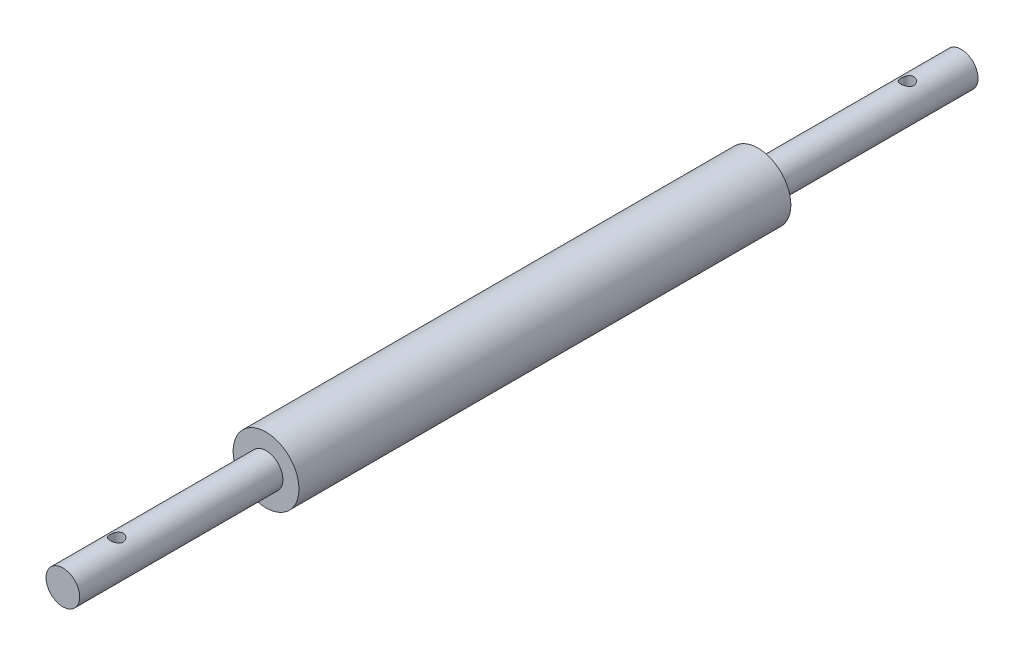
ISO-10303-21;
HEADER;
FILE_DESCRIPTION(('STEP AP214'),'2;1');
FILE_NAME('part.step','',(''),(''),'','','');
FILE_SCHEMA(('AUTOMOTIVE_DESIGN { 1 0 10303 214 1 1 1 1 }'));
ENDSEC;
DATA;
#1=APPLICATION_CONTEXT('core data for automotive mechanical design processes');
#2=APPLICATION_PROTOCOL_DEFINITION('international standard','automotive_design',2000,#1);
#3=PRODUCT_CONTEXT('',#1,'mechanical');
#4=PRODUCT('Part','Part','',(#3));
#5=PRODUCT_RELATED_PRODUCT_CATEGORY('part','',(#4));
#6=PRODUCT_DEFINITION_FORMATION('','',#4);
#7=PRODUCT_DEFINITION_CONTEXT('part definition',#1,'design');
#8=PRODUCT_DEFINITION('design','',#6,#7);
#9=PRODUCT_DEFINITION_SHAPE('','',#8);
#10=(LENGTH_UNIT() NAMED_UNIT(*) SI_UNIT(.MILLI.,.METRE.));
#11=(NAMED_UNIT(*) PLANE_ANGLE_UNIT() SI_UNIT($,.RADIAN.));
#12=(NAMED_UNIT(*) SI_UNIT($,.STERADIAN.) SOLID_ANGLE_UNIT());
#13=UNCERTAINTY_MEASURE_WITH_UNIT(LENGTH_MEASURE(1.E-05),#10,'distance_accuracy_value','');
#14=(GEOMETRIC_REPRESENTATION_CONTEXT(3) GLOBAL_UNCERTAINTY_ASSIGNED_CONTEXT((#13)) GLOBAL_UNIT_ASSIGNED_CONTEXT((#10,
#11,#12)) REPRESENTATION_CONTEXT('',''));
#15=CARTESIAN_POINT('',(0.,0.,0.));
#16=DIRECTION('',(0.,0.,1.));
#17=DIRECTION('',(1.,0.,0.));
#18=AXIS2_PLACEMENT_3D('',#15,#16,#17);
#19=CARTESIAN_POINT('',(49.9999999999997,120.4,173.5));
#20=DIRECTION('',(0.,0.,-1.));
#21=DIRECTION('',(-1.,0.,0.));
#22=AXIS2_PLACEMENT_3D('',#19,#20,#21);
#23=CYLINDRICAL_SURFACE('',#22,6.5);
#24=CARTESIAN_POINT('',(50.,113.9,-150.2));
#25=CARTESIAN_POINT('',(49.8648569360255,113.899995370137,-150.199993927366));
#26=CARTESIAN_POINT('',(49.7297543163098,113.904250781703,-150.210992010332));
#27=CARTESIAN_POINT('',(49.4636001063237,113.920799394986,-150.254504679692));
#28=CARTESIAN_POINT('',(49.3325477106707,113.933090987807,-150.287014959218));
#29=CARTESIAN_POINT('',(49.0783719967748,113.964396706734,-150.372223093158));
#30=CARTESIAN_POINT('',(48.9552334653472,113.983397449006,-150.424880773621));
#31=CARTESIAN_POINT('',(48.7195509109868,114.026240073069,-150.548679086722));
#32=CARTESIAN_POINT('',(48.6070098904103,114.050083320774,-150.619824935867));
#33=CARTESIAN_POINT('',(48.3907274132546,114.101342120172,-150.781869571504));
#34=CARTESIAN_POINT('',(48.287517270289,114.128862346074,-150.873444061664));
#35=CARTESIAN_POINT('',(48.0974862658747,114.183872117362,-151.072312088808));
#36=CARTESIAN_POINT('',(48.0106708066665,114.211361649679,-151.17961078649));
#37=CARTESIAN_POINT('',(47.8524265832136,114.264432533301,-151.412174979189));
#38=CARTESIAN_POINT('',(47.7817633689856,114.289891515449,-151.537992128593));
#39=CARTESIAN_POINT('',(47.6628381082266,114.334380814589,-151.800856659822));
#40=CARTESIAN_POINT('',(47.6145665843167,114.353413850462,-151.937899261474));
#41=CARTESIAN_POINT('',(47.5439173709796,114.381772691875,-152.213196736226));
#42=CARTESIAN_POINT('',(47.5205219879901,114.391478308187,-152.351149953308));
#43=CARTESIAN_POINT('',(47.4971080052481,114.401191051695,-152.629339459977));
#44=CARTESIAN_POINT('',(47.4970790955748,114.401202456239,-152.769574715353));
#45=CARTESIAN_POINT('',(47.5196234368706,114.391851624264,-153.038864258152));
#46=CARTESIAN_POINT('',(47.5407620429355,114.383084370669,-153.168063212915));
#47=CARTESIAN_POINT('',(47.6026619386656,114.358156596172,-153.420915079407));
#48=CARTESIAN_POINT('',(47.6434263425707,114.341994901932,-153.544567107539));
#49=CARTESIAN_POINT('',(47.744173360771,114.303756298309,-153.785658311782));
#50=CARTESIAN_POINT('',(47.8045154952335,114.28157010805,-153.902929152217));
#51=CARTESIAN_POINT('',(47.9424538839718,114.233816323288,-154.126087878502));
#52=CARTESIAN_POINT('',(48.0200563076405,114.208247521055,-154.231971674123));
#53=CARTESIAN_POINT('',(48.1967948466707,114.154396548195,-154.437259161246));
#54=CARTESIAN_POINT('',(48.297068555506,114.126050611602,-154.53566921961));
#55=CARTESIAN_POINT('',(48.5130136095442,114.071393131742,-154.714580669283));
#56=CARTESIAN_POINT('',(48.62868756797,114.045081934944,-154.795079015001));
#57=CARTESIAN_POINT('',(48.8747908924492,113.996885932677,-154.937055048215));
#58=CARTESIAN_POINT('',(49.0054379008434,113.975084093005,-154.998185657593));
#59=CARTESIAN_POINT('',(49.2762103335865,113.93898298564,-155.097266102549));
#60=CARTESIAN_POINT('',(49.4163312860351,113.92468020576,-155.135226791131));
#61=CARTESIAN_POINT('',(49.6937241259577,113.90581476875,-155.184942181762));
#62=CARTESIAN_POINT('',(49.8307228227463,113.900755779516,-155.198033878958));
#63=CARTESIAN_POINT('',(50.1050380560697,113.899402939048,-155.201553438037));
#64=CARTESIAN_POINT('',(50.2423545101173,113.903107023036,-155.191986638772));
#65=CARTESIAN_POINT('',(50.5075233914846,113.91853747347,-155.15146491566));
#66=CARTESIAN_POINT('',(50.6355332786326,113.929929936224,-155.121399693969));
#67=CARTESIAN_POINT('',(50.8845911124195,113.959252047836,-155.041920769499));
#68=CARTESIAN_POINT('',(51.0056381538334,113.977182544477,-154.992504557429));
#69=CARTESIAN_POINT('',(51.2413976272735,114.018488371272,-154.874132384767));
#70=CARTESIAN_POINT('',(51.3558122909773,114.042010519008,-154.804636185622));
#71=CARTESIAN_POINT('',(51.5717472094606,114.091916869993,-154.648682871873));
#72=CARTESIAN_POINT('',(51.6732625124397,114.118302165183,-154.562219276043));
#73=CARTESIAN_POINT('',(51.867008663459,114.173040176701,-154.368580249317));
#74=CARTESIAN_POINT('',(51.9582939990394,114.201414643799,-154.260462461031));
#75=CARTESIAN_POINT('',(52.1216298075656,114.255400121447,-154.029904597358));
#76=CARTESIAN_POINT('',(52.1936780477103,114.281010811008,-153.907462861796));
#77=CARTESIAN_POINT('',(52.3167016588595,114.326513011289,-153.650423952603));
#78=CARTESIAN_POINT('',(52.3675457507259,114.346368667284,-153.515757160765));
#79=CARTESIAN_POINT('',(52.4454786278655,114.377423472433,-153.238789394497));
#80=CARTESIAN_POINT('',(52.4725831636482,114.388628360536,-153.09649354834));
#81=CARTESIAN_POINT('',(52.5008221053295,114.400324973139,-152.818611399132));
#82=CARTESIAN_POINT('',(52.5035796294326,114.401486156865,-152.68321698093));
#83=CARTESIAN_POINT('',(52.4872441285209,114.394694525215,-152.413998907565));
#84=CARTESIAN_POINT('',(52.4681534084365,114.386742671239,-152.280175088212));
#85=CARTESIAN_POINT('',(52.4099513674169,114.36319107724,-152.022503937197));
#86=CARTESIAN_POINT('',(52.3715382839678,114.347858817028,-151.898472297688));
#87=CARTESIAN_POINT('',(52.276411151596,114.311442436843,-151.658550206541));
#88=CARTESIAN_POINT('',(52.2196923673986,114.290356828826,-151.542661870848));
#89=CARTESIAN_POINT('',(52.085993195051,114.243385216856,-151.315464696426));
#90=CARTESIAN_POINT('',(52.0080793942802,114.21730064338,-151.204746758524));
#91=CARTESIAN_POINT('',(51.8356157399033,114.163922938996,-150.997440282091));
#92=CARTESIAN_POINT('',(51.7410604619884,114.136629416208,-150.900856369419));
#93=CARTESIAN_POINT('',(51.5314383021902,114.08200394833,-150.718824624031));
#94=CARTESIAN_POINT('',(51.4154988293532,114.054761919151,-150.63434994106));
#95=CARTESIAN_POINT('',(51.1701071623707,114.004961723837,-150.486089140357));
#96=CARTESIAN_POINT('',(51.0406527047282,113.982404344186,-150.422306495509));
#97=CARTESIAN_POINT('',(50.7629008422325,113.943308605623,-150.314295580981));
#98=CARTESIAN_POINT('',(50.6139250375314,113.927259294457,-150.271615623945));
#99=CARTESIAN_POINT('',(50.3099460978443,113.905610637558,-150.214479395075));
#100=CARTESIAN_POINT('',(50.1549464660004,113.900005308307,-150.200006962497));
#101=CARTESIAN_POINT('',(50.,113.9,-150.2));
#102=B_SPLINE_CURVE_WITH_KNOTS('',3,(#24,#25,#26,#27,#28,#29,#30,#31,#32,#33,#34,#35,#36,#37,
#38,#39,#40,#41,#42,#43,#44,#45,#46,#47,#48,#49,#50,#51,#52,#53,#54,#55,#56,#57,#58,#59,#60,#61,
#62,#63,#64,#65,#66,#67,#68,#69,#70,#71,#72,#73,#74,#75,#76,#77,#78,#79,#80,#81,#82,#83,#84,#85,
#86,#87,#88,#89,#90,#91,#92,#93,#94,#95,#96,#97,#98,#99,#100,#101),.UNSPECIFIED.,.T.,.F.,(4,2,2,
2,2,2,2,2,2,2,2,2,2,2,2,2,2,2,2,2,2,2,2,2,2,2,2,2,2,2,2,2,2,2,2,2,2,2,4),(0.,0.404857395673165,
0.809633761045258,1.21360717298343,1.61769469151933,2.03792903302861,2.45830160597863,
2.8956990771273,3.33291124861785,3.75145366078395,4.1698114006033,4.56161223088487,
4.95347525299,5.35298551114873,5.75263879750163,6.18066348321893,6.60876089197116,
7.04414506400745,7.47932514126758,7.89036278979613,8.30130359821625,8.69545686414669,
9.08966125783838,9.4956566096056,9.90180734683235,10.3327599285419,10.7637625081092,
11.1973952581665,11.6307400870075,12.0349578310579,12.4391329351611,12.8296520191847,
13.2202722028207,13.6321153154032,14.0440929181879,14.4800085178991,14.9159972424678,
15.3804472276237,15.8446310403092),.UNSPECIFIED.);
#103=CARTESIAN_POINT('',(50.,113.9,-150.2));
#104=VERTEX_POINT('',#103);
#105=EDGE_CURVE('E38',#104,#104,#102,.T.);
#106=ORIENTED_EDGE('',*,*,#105,.F.);
#107=EDGE_LOOP('',(#106));
#108=FACE_BOUND('',#107,.T.);
#109=CARTESIAN_POINT('',(50.,126.9,-150.2));
#110=CARTESIAN_POINT('',(50.1351430639745,126.900004629863,-150.199993927366));
#111=CARTESIAN_POINT('',(50.2702456836902,126.895749218297,-150.210992010332));
#112=CARTESIAN_POINT('',(50.5363998936764,126.879200605014,-150.254504679692));
#113=CARTESIAN_POINT('',(50.6674522893293,126.866909012193,-150.287014959218));
#114=CARTESIAN_POINT('',(50.9216280032252,126.835603293266,-150.372223093158));
#115=CARTESIAN_POINT('',(51.0447665346528,126.816602550994,-150.424880773621));
#116=CARTESIAN_POINT('',(51.2804490890132,126.773759926931,-150.548679086722));
#117=CARTESIAN_POINT('',(51.3929901095897,126.749916679226,-150.619824935867));
#118=CARTESIAN_POINT('',(51.6092725867455,126.698657879828,-150.781869571504));
#119=CARTESIAN_POINT('',(51.7124827297111,126.671137653926,-150.873444061664));
#120=CARTESIAN_POINT('',(51.9025137341253,126.616127882637,-151.072312088808));
#121=CARTESIAN_POINT('',(51.9893291933336,126.588638350321,-151.17961078649));
#122=CARTESIAN_POINT('',(52.1475734167864,126.535567466699,-151.412174979189));
#123=CARTESIAN_POINT('',(52.2182366310144,126.510108484551,-151.537992128593));
#124=CARTESIAN_POINT('',(52.3371618917734,126.46561918541,-151.800856659822));
#125=CARTESIAN_POINT('',(52.3854334156833,126.446586149538,-151.937899261474));
#126=CARTESIAN_POINT('',(52.4560826290204,126.418227308125,-152.213196736226));
#127=CARTESIAN_POINT('',(52.4794780120099,126.408521691813,-152.351149953308));
#128=CARTESIAN_POINT('',(52.5028919947519,126.398808948305,-152.629339459977));
#129=CARTESIAN_POINT('',(52.5029209044252,126.398797543761,-152.769574715353));
#130=CARTESIAN_POINT('',(52.4803765631294,126.408148375736,-153.038864258152));
#131=CARTESIAN_POINT('',(52.4592379570645,126.416915629331,-153.168063212915));
#132=CARTESIAN_POINT('',(52.3973380613344,126.441843403828,-153.420915079407));
#133=CARTESIAN_POINT('',(52.3565736574293,126.458005098068,-153.544567107539));
#134=CARTESIAN_POINT('',(52.255826639229,126.496243701691,-153.785658311782));
#135=CARTESIAN_POINT('',(52.1954845047665,126.518429891949,-153.902929152217));
#136=CARTESIAN_POINT('',(52.0575461160282,126.566183676712,-154.126087878502));
#137=CARTESIAN_POINT('',(51.9799436923595,126.591752478945,-154.231971674123));
#138=CARTESIAN_POINT('',(51.8032051533293,126.645603451805,-154.437259161246));
#139=CARTESIAN_POINT('',(51.702931444494,126.673949388398,-154.53566921961));
#140=CARTESIAN_POINT('',(51.4869863904558,126.728606868258,-154.714580669283));
#141=CARTESIAN_POINT('',(51.37131243203,126.754918065056,-154.795079015001));
#142=CARTESIAN_POINT('',(51.1252091075508,126.803114067323,-154.937055048215));
#143=CARTESIAN_POINT('',(50.9945620991566,126.824915906994,-154.998185657593));
#144=CARTESIAN_POINT('',(50.7237896664135,126.86101701436,-155.097266102549));
#145=CARTESIAN_POINT('',(50.583668713965,126.875319794239,-155.135226791131));
#146=CARTESIAN_POINT('',(50.3062758740423,126.89418523125,-155.184942181762));
#147=CARTESIAN_POINT('',(50.1692771772537,126.899244220484,-155.198033878958));
#148=CARTESIAN_POINT('',(49.8949619439303,126.900597060952,-155.201553438037));
#149=CARTESIAN_POINT('',(49.7576454898827,126.896892976964,-155.191986638772));
#150=CARTESIAN_POINT('',(49.4924766085154,126.88146252653,-155.15146491566));
#151=CARTESIAN_POINT('',(49.3644667213674,126.870070063776,-155.121399693969));
#152=CARTESIAN_POINT('',(49.1154088875804,126.840747952164,-155.041920769499));
#153=CARTESIAN_POINT('',(48.9943618461666,126.822817455523,-154.992504557429));
#154=CARTESIAN_POINT('',(48.7586023727265,126.781511628728,-154.874132384767));
#155=CARTESIAN_POINT('',(48.6441877090227,126.757989480992,-154.804636185622));
#156=CARTESIAN_POINT('',(48.4282527905394,126.708083130007,-154.648682871873));
#157=CARTESIAN_POINT('',(48.3267374875602,126.681697834817,-154.562219276043));
#158=CARTESIAN_POINT('',(48.132991336541,126.626959823299,-154.368580249317));
#159=CARTESIAN_POINT('',(48.0417060009606,126.598585356201,-154.260462461031));
#160=CARTESIAN_POINT('',(47.8783701924343,126.544599878553,-154.029904597358));
#161=CARTESIAN_POINT('',(47.8063219522897,126.518989188993,-153.907462861796));
#162=CARTESIAN_POINT('',(47.6832983411405,126.473486988711,-153.650423952603));
#163=CARTESIAN_POINT('',(47.6324542492741,126.453631332716,-153.515757160765));
#164=CARTESIAN_POINT('',(47.5545213721345,126.422576527567,-153.238789394497));
#165=CARTESIAN_POINT('',(47.5274168363518,126.411371639464,-153.09649354834));
#166=CARTESIAN_POINT('',(47.4991778946705,126.399675026861,-152.818611399132));
#167=CARTESIAN_POINT('',(47.4964203705674,126.398513843135,-152.68321698093));
#168=CARTESIAN_POINT('',(47.5127558714792,126.405305474785,-152.413998907565));
#169=CARTESIAN_POINT('',(47.5318465915635,126.413257328761,-152.280175088212));
#170=CARTESIAN_POINT('',(47.5900486325831,126.43680892276,-152.022503937197));
#171=CARTESIAN_POINT('',(47.6284617160322,126.452141182972,-151.898472297688));
#172=CARTESIAN_POINT('',(47.723588848404,126.488557563157,-151.658550206541));
#173=CARTESIAN_POINT('',(47.7803076326014,126.509643171174,-151.542661870848));
#174=CARTESIAN_POINT('',(47.914006804949,126.556614783144,-151.315464696426));
#175=CARTESIAN_POINT('',(47.9919206057199,126.582699356621,-151.204746758524));
#176=CARTESIAN_POINT('',(48.1643842600968,126.636077061004,-150.997440282091));
#177=CARTESIAN_POINT('',(48.2589395380117,126.663370583792,-150.900856369419));
#178=CARTESIAN_POINT('',(48.4685616978099,126.71799605167,-150.718824624031));
#179=CARTESIAN_POINT('',(48.5845011706469,126.745238080849,-150.63434994106));
#180=CARTESIAN_POINT('',(48.8298928376294,126.795038276163,-150.486089140357));
#181=CARTESIAN_POINT('',(48.9593472952718,126.817595655814,-150.422306495509));
#182=CARTESIAN_POINT('',(49.2370991577676,126.856691394377,-150.314295580981));
#183=CARTESIAN_POINT('',(49.3860749624686,126.872740705543,-150.271615623945));
#184=CARTESIAN_POINT('',(49.6900539021558,126.894389362442,-150.214479395075));
#185=CARTESIAN_POINT('',(49.8450535339997,126.899994691693,-150.200006962497));
#186=CARTESIAN_POINT('',(50.,126.9,-150.2));
#187=B_SPLINE_CURVE_WITH_KNOTS('',3,(#109,#110,#111,#112,#113,#114,#115,#116,#117,#118,#119,
#120,#121,#122,#123,#124,#125,#126,#127,#128,#129,#130,#131,#132,#133,#134,#135,#136,#137,#138,
#139,#140,#141,#142,#143,#144,#145,#146,#147,#148,#149,#150,#151,#152,#153,#154,#155,#156,#157,
#158,#159,#160,#161,#162,#163,#164,#165,#166,#167,#168,#169,#170,#171,#172,#173,#174,#175,#176,
#177,#178,#179,#180,#181,#182,#183,#184,#185,#186),.UNSPECIFIED.,.T.,.F.,(4,2,2,2,2,2,2,2,2,2,2,
2,2,2,2,2,2,2,2,2,2,2,2,2,2,2,2,2,2,2,2,2,2,2,2,2,2,2,4),(0.,0.404857395673187,
0.809633761045283,1.21360717298345,1.61769469151939,2.03792903302869,2.45830160597873,
2.89569907712739,3.33291124861794,3.75145366078399,4.16981140060339,4.56161223088494,
4.95347525299004,5.3529855111488,5.75263879750169,6.18066348321899,6.60876089197121,
7.04414506400752,7.47932514126764,7.89036278979621,8.30130359821635,8.69545686414679,
9.08966125783846,9.4956566096057,9.90180734683243,10.332759928542,10.7637625081093,
11.1973952581666,11.6307400870075,12.034957831058,12.4391329351612,12.8296520191848,
13.2202722028208,13.6321153154033,14.044092918188,14.4800085178992,14.9159972424679,
15.3804472276238,15.8446310403092),.UNSPECIFIED.);
#188=CARTESIAN_POINT('',(50.,126.9,-150.2));
#189=VERTEX_POINT('',#188);
#190=EDGE_CURVE('E110',#189,#189,#187,.T.);
#191=ORIENTED_EDGE('',*,*,#190,.F.);
#192=EDGE_LOOP('',(#191));
#193=FACE_BOUND('',#192,.T.);
#194=CARTESIAN_POINT('',(49.9999999999997,120.4,-173.5));
#195=DIRECTION('',(0.,0.,-1.));
#196=DIRECTION('',(-1.,0.,0.));
#197=AXIS2_PLACEMENT_3D('',#194,#195,#196);
#198=CIRCLE('',#197,6.5);
#199=CARTESIAN_POINT('',(43.4999999999997,120.4,-173.5));
#200=VERTEX_POINT('',#199);
#201=EDGE_CURVE('E51',#200,#200,#198,.T.);
#202=ORIENTED_EDGE('',*,*,#201,.F.);
#203=EDGE_LOOP('',(#202));
#204=FACE_BOUND('',#203,.T.);
#205=CARTESIAN_POINT('',(49.9999999999997,120.4,-95.));
#206=DIRECTION('',(0.,0.,1.));
#207=DIRECTION('',(1.,0.,0.));
#208=AXIS2_PLACEMENT_3D('',#205,#206,#207);
#209=CIRCLE('',#208,6.5);
#210=CARTESIAN_POINT('',(56.4999999999997,120.4,-95.));
#211=VERTEX_POINT('',#210);
#212=EDGE_CURVE('E55',#211,#211,#209,.F.);
#213=ORIENTED_EDGE('',*,*,#212,.T.);
#214=EDGE_LOOP('',(#213));
#215=FACE_BOUND('',#214,.T.);
#216=ADVANCED_FACE('F33',(#108,#193,#204,#215),#23,.T.);
#217=CARTESIAN_POINT('',(49.9999999999997,120.4,-173.5));
#218=DIRECTION('',(0.,0.,-1.));
#219=DIRECTION('',(-1.,0.,0.));
#220=AXIS2_PLACEMENT_3D('',#217,#218,#219);
#221=PLANE('',#220);
#222=ORIENTED_EDGE('',*,*,#201,.T.);
#223=EDGE_LOOP('',(#222));
#224=FACE_BOUND('',#223,.T.);
#225=ADVANCED_FACE('F89',(#224),#221,.T.);
#226=CARTESIAN_POINT('',(49.9999999999997,120.4,-95.));
#227=DIRECTION('',(0.,0.,1.));
#228=DIRECTION('',(1.,0.,0.));
#229=AXIS2_PLACEMENT_3D('',#226,#227,#228);
#230=CYLINDRICAL_SURFACE('',#229,12.7);
#231=CARTESIAN_POINT('',(49.9999999999997,120.4,-95.));
#232=DIRECTION('',(0.,0.,1.));
#233=DIRECTION('',(1.,0.,0.));
#234=AXIS2_PLACEMENT_3D('',#231,#232,#233);
#235=CIRCLE('',#234,12.7);
#236=CARTESIAN_POINT('',(62.6999999999997,120.4,-95.));
#237=VERTEX_POINT('',#236);
#238=EDGE_CURVE('E58',#237,#237,#235,.T.);
#239=ORIENTED_EDGE('',*,*,#238,.T.);
#240=EDGE_LOOP('',(#239));
#241=FACE_BOUND('',#240,.T.);
#242=CARTESIAN_POINT('',(49.9999999999997,120.4,95.));
#243=DIRECTION('',(0.,0.,1.));
#244=DIRECTION('',(1.,0.,0.));
#245=AXIS2_PLACEMENT_3D('',#242,#243,#244);
#246=CIRCLE('',#245,12.7);
#247=CARTESIAN_POINT('',(62.6999999999997,120.4,95.));
#248=VERTEX_POINT('',#247);
#249=EDGE_CURVE('E118',#248,#248,#246,.T.);
#250=ORIENTED_EDGE('',*,*,#249,.F.);
#251=EDGE_LOOP('',(#250));
#252=FACE_BOUND('',#251,.T.);
#253=ADVANCED_FACE('F85',(#241,#252),#230,.T.);
#254=CARTESIAN_POINT('',(49.9999999999997,120.4,-95.));
#255=DIRECTION('',(0.,0.,1.));
#256=DIRECTION('',(1.,0.,0.));
#257=AXIS2_PLACEMENT_3D('',#254,#255,#256);
#258=PLANE('',#257);
#259=ORIENTED_EDGE('',*,*,#212,.F.);
#260=EDGE_LOOP('',(#259));
#261=FACE_BOUND('',#260,.T.);
#262=ORIENTED_EDGE('',*,*,#238,.F.);
#263=EDGE_LOOP('',(#262));
#264=FACE_BOUND('',#263,.T.);
#265=ADVANCED_FACE('F82',(#261,#264),#258,.F.);
#266=CARTESIAN_POINT('',(49.9999999999997,120.4,95.));
#267=DIRECTION('',(0.,0.,1.));
#268=DIRECTION('',(1.,0.,0.));
#269=AXIS2_PLACEMENT_3D('',#266,#267,#268);
#270=PLANE('',#269);
#271=CARTESIAN_POINT('',(49.9999999999997,120.4,95.));
#272=DIRECTION('',(0.,0.,1.));
#273=DIRECTION('',(1.,0.,0.));
#274=AXIS2_PLACEMENT_3D('',#271,#272,#273);
#275=CIRCLE('',#274,6.5);
#276=CARTESIAN_POINT('',(56.4999999999997,120.4,95.));
#277=VERTEX_POINT('',#276);
#278=EDGE_CURVE('E10',#277,#277,#275,.F.);
#279=ORIENTED_EDGE('',*,*,#278,.T.);
#280=EDGE_LOOP('',(#279));
#281=FACE_BOUND('',#280,.T.);
#282=ORIENTED_EDGE('',*,*,#249,.T.);
#283=EDGE_LOOP('',(#282));
#284=FACE_BOUND('',#283,.T.);
#285=ADVANCED_FACE('F77',(#281,#284),#270,.T.);
#286=CARTESIAN_POINT('',(49.9999999999997,120.4,173.5));
#287=DIRECTION('',(0.,0.,-1.));
#288=DIRECTION('',(-1.,0.,0.));
#289=AXIS2_PLACEMENT_3D('',#286,#287,#288);
#290=PLANE('',#289);
#291=CARTESIAN_POINT('',(49.9999999999997,120.4,173.5));
#292=DIRECTION('',(0.,0.,-1.));
#293=DIRECTION('',(-1.,0.,0.));
#294=AXIS2_PLACEMENT_3D('',#291,#292,#293);
#295=CIRCLE('',#294,6.5);
#296=CARTESIAN_POINT('',(43.4999999999997,120.4,173.5));
#297=VERTEX_POINT('',#296);
#298=EDGE_CURVE('E46',#297,#297,#295,.T.);
#299=ORIENTED_EDGE('',*,*,#298,.F.);
#300=EDGE_LOOP('',(#299));
#301=FACE_BOUND('',#300,.T.);
#302=ADVANCED_FACE('F81',(#301),#290,.F.);
#303=CARTESIAN_POINT('',(50.,113.9,155.2));
#304=CARTESIAN_POINT('',(49.8648569360255,113.899995370137,155.200006072634));
#305=CARTESIAN_POINT('',(49.7297543163098,113.904250781703,155.189007989668));
#306=CARTESIAN_POINT('',(49.4636001063237,113.920799394986,155.145495320308));
#307=CARTESIAN_POINT('',(49.3325477106707,113.933090987807,155.112985040782));
#308=CARTESIAN_POINT('',(49.0783719967748,113.964396706734,155.027776906842));
#309=CARTESIAN_POINT('',(48.9552334653472,113.983397449006,154.975119226379));
#310=CARTESIAN_POINT('',(48.7195509109868,114.026240073069,154.851320913278));
#311=CARTESIAN_POINT('',(48.6070098904103,114.050083320774,154.780175064133));
#312=CARTESIAN_POINT('',(48.3907274132546,114.101342120172,154.618130428496));
#313=CARTESIAN_POINT('',(48.287517270289,114.128862346074,154.526555938336));
#314=CARTESIAN_POINT('',(48.0974862658747,114.183872117362,154.327687911192));
#315=CARTESIAN_POINT('',(48.0106708066664,114.211361649679,154.22038921351));
#316=CARTESIAN_POINT('',(47.8524265832136,114.264432533301,153.987825020811));
#317=CARTESIAN_POINT('',(47.7817633689856,114.289891515449,153.862007871407));
#318=CARTESIAN_POINT('',(47.6628381082266,114.33438081459,153.599143340178));
#319=CARTESIAN_POINT('',(47.6145665843167,114.353413850462,153.462100738526));
#320=CARTESIAN_POINT('',(47.5439173709796,114.381772691875,153.186803263774));
#321=CARTESIAN_POINT('',(47.5205219879901,114.391478308187,153.048850046692));
#322=CARTESIAN_POINT('',(47.4971080052481,114.401191051695,152.770660540023));
#323=CARTESIAN_POINT('',(47.4970790955748,114.401202456239,152.630425284647));
#324=CARTESIAN_POINT('',(47.5196234368706,114.391851624264,152.361135741848));
#325=CARTESIAN_POINT('',(47.5407620429355,114.383084370669,152.231936787085));
#326=CARTESIAN_POINT('',(47.6026619386656,114.358156596172,151.979084920593));
#327=CARTESIAN_POINT('',(47.6434263425707,114.341994901932,151.855432892461));
#328=CARTESIAN_POINT('',(47.744173360771,114.303756298309,151.614341688218));
#329=CARTESIAN_POINT('',(47.8045154952335,114.28157010805,151.497070847783));
#330=CARTESIAN_POINT('',(47.9424538839718,114.233816323288,151.273912121498));
#331=CARTESIAN_POINT('',(48.0200563076405,114.208247521055,151.168028325877));
#332=CARTESIAN_POINT('',(48.1967948466707,114.154396548195,150.962740838754));
#333=CARTESIAN_POINT('',(48.297068555506,114.126050611602,150.86433078039));
#334=CARTESIAN_POINT('',(48.5130136095443,114.071393131742,150.685419330717));
#335=CARTESIAN_POINT('',(48.62868756797,114.045081934944,150.604920984999));
#336=CARTESIAN_POINT('',(48.8747908924492,113.996885932677,150.462944951785));
#337=CARTESIAN_POINT('',(49.0054379008434,113.975084093005,150.401814342407));
#338=CARTESIAN_POINT('',(49.2762103335865,113.93898298564,150.302733897451));
#339=CARTESIAN_POINT('',(49.416331286035,113.92468020576,150.264773208869));
#340=CARTESIAN_POINT('',(49.6937241259576,113.90581476875,150.215057818238));
#341=CARTESIAN_POINT('',(49.8307228227463,113.900755779516,150.201966121042));
#342=CARTESIAN_POINT('',(50.1050380560697,113.899402939048,150.198446561963));
#343=CARTESIAN_POINT('',(50.2423545101173,113.903107023036,150.208013361228));
#344=CARTESIAN_POINT('',(50.5075233914846,113.91853747347,150.24853508434));
#345=CARTESIAN_POINT('',(50.6355332786326,113.929929936224,150.278600306031));
#346=CARTESIAN_POINT('',(50.8845911124195,113.959252047836,150.358079230501));
#347=CARTESIAN_POINT('',(51.0056381538334,113.977182544477,150.407495442571));
#348=CARTESIAN_POINT('',(51.2413976272735,114.018488371272,150.525867615233));
#349=CARTESIAN_POINT('',(51.3558122909773,114.042010519008,150.595363814378));
#350=CARTESIAN_POINT('',(51.5717472094606,114.091916869993,150.751317128127));
#351=CARTESIAN_POINT('',(51.6732625124397,114.118302165183,150.837780723957));
#352=CARTESIAN_POINT('',(51.867008663459,114.173040176701,151.031419750683));
#353=CARTESIAN_POINT('',(51.9582939990394,114.201414643799,151.139537538969));
#354=CARTESIAN_POINT('',(52.1216298075656,114.255400121447,151.370095402642));
#355=CARTESIAN_POINT('',(52.1936780477103,114.281010811008,151.492537138204));
#356=CARTESIAN_POINT('',(52.3167016588594,114.326513011289,151.749576047397));
#357=CARTESIAN_POINT('',(52.3675457507259,114.346368667284,151.884242839235));
#358=CARTESIAN_POINT('',(52.4454786278655,114.377423472433,152.161210605503));
#359=CARTESIAN_POINT('',(52.4725831636482,114.388628360536,152.30350645166));
#360=CARTESIAN_POINT('',(52.5008221053295,114.400324973139,152.581388600868));
#361=CARTESIAN_POINT('',(52.5035796294326,114.401486156865,152.71678301907));
#362=CARTESIAN_POINT('',(52.4872441285208,114.394694525215,152.986001092435));
#363=CARTESIAN_POINT('',(52.4681534084365,114.386742671239,153.119824911788));
#364=CARTESIAN_POINT('',(52.4099513674169,114.36319107724,153.377496062803));
#365=CARTESIAN_POINT('',(52.3715382839678,114.347858817028,153.501527702312));
#366=CARTESIAN_POINT('',(52.276411151596,114.311442436843,153.741449793459));
#367=CARTESIAN_POINT('',(52.2196923673986,114.290356828826,153.857338129152));
#368=CARTESIAN_POINT('',(52.085993195051,114.243385216856,154.084535303574));
#369=CARTESIAN_POINT('',(52.0080793942802,114.21730064338,154.195253241476));
#370=CARTESIAN_POINT('',(51.8356157399033,114.163922938996,154.402559717909));
#371=CARTESIAN_POINT('',(51.7410604619884,114.136629416208,154.499143630581));
#372=CARTESIAN_POINT('',(51.5314383021902,114.08200394833,154.681175375969));
#373=CARTESIAN_POINT('',(51.4154988293532,114.054761919151,154.76565005894));
#374=CARTESIAN_POINT('',(51.1701071623707,114.004961723837,154.913910859643));
#375=CARTESIAN_POINT('',(51.0406527047282,113.982404344186,154.977693504491));
#376=CARTESIAN_POINT('',(50.7629008422325,113.943308605623,155.085704419019));
#377=CARTESIAN_POINT('',(50.6139250375314,113.927259294457,155.128384376055));
#378=CARTESIAN_POINT('',(50.3099460978442,113.905610637558,155.185520604925));
#379=CARTESIAN_POINT('',(50.1549464660004,113.900005308307,155.199993037503));
#380=CARTESIAN_POINT('',(50.,113.9,155.2));
#381=B_SPLINE_CURVE_WITH_KNOTS('',3,(#303,#304,#305,#306,#307,#308,#309,#310,#311,#312,#313,
#314,#315,#316,#317,#318,#319,#320,#321,#322,#323,#324,#325,#326,#327,#328,#329,#330,#331,#332,
#333,#334,#335,#336,#337,#338,#339,#340,#341,#342,#343,#344,#345,#346,#347,#348,#349,#350,#351,
#352,#353,#354,#355,#356,#357,#358,#359,#360,#361,#362,#363,#364,#365,#366,#367,#368,#369,#370,
#371,#372,#373,#374,#375,#376,#377,#378,#379,#380),.UNSPECIFIED.,.T.,.F.,(4,2,2,2,2,2,2,2,2,2,2,
2,2,2,2,2,2,2,2,2,2,2,2,2,2,2,2,2,2,2,2,2,2,2,2,2,2,2,4),(0.,0.404857395673165,
0.809633761045258,1.21360717298343,1.61769469151935,2.03792903302865,2.45830160597866,
2.89569907712729,3.33291124861787,3.75145366078394,4.16981140060326,4.56161223088487,
4.95347525299,5.35298551114875,5.75263879750163,6.18066348321893,6.60876089197114,
7.04414506400744,7.47932514126753,7.8903627897961,8.30130359821624,8.69545686414666,
9.08966125783835,9.49565660960559,9.90180734683232,10.3327599285419,10.7637625081092,
11.1973952581665,11.6307400870075,12.0349578310578,12.4391329351611,12.8296520191847,
13.2202722028207,13.6321153154032,14.0440929181879,14.4800085178991,14.9159972424678,
15.3804472276237,15.8446310403092),.UNSPECIFIED.);
#382=CARTESIAN_POINT('',(50.,113.9,155.2));
#383=VERTEX_POINT('',#382);
#384=EDGE_CURVE('E66',#383,#383,#381,.T.);
#385=ORIENTED_EDGE('',*,*,#384,.F.);
#386=EDGE_LOOP('',(#385));
#387=FACE_BOUND('',#386,.T.);
#388=CARTESIAN_POINT('',(50.,126.9,155.2));
#389=CARTESIAN_POINT('',(50.1351430639745,126.900004629863,155.200006072634));
#390=CARTESIAN_POINT('',(50.2702456836902,126.895749218297,155.189007989668));
#391=CARTESIAN_POINT('',(50.5363998936764,126.879200605014,155.145495320308));
#392=CARTESIAN_POINT('',(50.6674522893293,126.866909012193,155.112985040782));
#393=CARTESIAN_POINT('',(50.9216280032252,126.835603293266,155.027776906842));
#394=CARTESIAN_POINT('',(51.0447665346528,126.816602550994,154.975119226379));
#395=CARTESIAN_POINT('',(51.2804490890132,126.773759926931,154.851320913278));
#396=CARTESIAN_POINT('',(51.3929901095897,126.749916679226,154.780175064133));
#397=CARTESIAN_POINT('',(51.6092725867455,126.698657879828,154.618130428496));
#398=CARTESIAN_POINT('',(51.712482729711,126.671137653926,154.526555938336));
#399=CARTESIAN_POINT('',(51.9025137341253,126.616127882637,154.327687911192));
#400=CARTESIAN_POINT('',(51.9893291933336,126.588638350321,154.22038921351));
#401=CARTESIAN_POINT('',(52.1475734167864,126.535567466699,153.987825020811));
#402=CARTESIAN_POINT('',(52.2182366310144,126.510108484551,153.862007871407));
#403=CARTESIAN_POINT('',(52.3371618917734,126.46561918541,153.599143340178));
#404=CARTESIAN_POINT('',(52.3854334156833,126.446586149538,153.462100738526));
#405=CARTESIAN_POINT('',(52.4560826290204,126.418227308125,153.186803263774));
#406=CARTESIAN_POINT('',(52.4794780120099,126.408521691813,153.048850046692));
#407=CARTESIAN_POINT('',(52.5028919947519,126.398808948305,152.770660540023));
#408=CARTESIAN_POINT('',(52.5029209044252,126.398797543761,152.630425284647));
#409=CARTESIAN_POINT('',(52.4803765631294,126.408148375736,152.361135741848));
#410=CARTESIAN_POINT('',(52.4592379570645,126.416915629331,152.231936787085));
#411=CARTESIAN_POINT('',(52.3973380613344,126.441843403828,151.979084920593));
#412=CARTESIAN_POINT('',(52.3565736574293,126.458005098068,151.855432892461));
#413=CARTESIAN_POINT('',(52.255826639229,126.496243701691,151.614341688218));
#414=CARTESIAN_POINT('',(52.1954845047665,126.518429891949,151.497070847783));
#415=CARTESIAN_POINT('',(52.0575461160282,126.566183676712,151.273912121498));
#416=CARTESIAN_POINT('',(51.9799436923595,126.591752478945,151.168028325877));
#417=CARTESIAN_POINT('',(51.8032051533294,126.645603451805,150.962740838754));
#418=CARTESIAN_POINT('',(51.702931444494,126.673949388398,150.86433078039));
#419=CARTESIAN_POINT('',(51.4869863904558,126.728606868258,150.685419330717));
#420=CARTESIAN_POINT('',(51.37131243203,126.754918065056,150.604920984999));
#421=CARTESIAN_POINT('',(51.1252091075508,126.803114067323,150.462944951785));
#422=CARTESIAN_POINT('',(50.9945620991566,126.824915906994,150.401814342407));
#423=CARTESIAN_POINT('',(50.7237896664135,126.86101701436,150.302733897451));
#424=CARTESIAN_POINT('',(50.583668713965,126.875319794239,150.264773208869));
#425=CARTESIAN_POINT('',(50.3062758740424,126.89418523125,150.215057818238));
#426=CARTESIAN_POINT('',(50.1692771772537,126.899244220484,150.201966121042));
#427=CARTESIAN_POINT('',(49.8949619439303,126.900597060952,150.198446561963));
#428=CARTESIAN_POINT('',(49.7576454898827,126.896892976964,150.208013361228));
#429=CARTESIAN_POINT('',(49.4924766085154,126.88146252653,150.24853508434));
#430=CARTESIAN_POINT('',(49.3644667213674,126.870070063776,150.278600306031));
#431=CARTESIAN_POINT('',(49.1154088875805,126.840747952164,150.358079230501));
#432=CARTESIAN_POINT('',(48.9943618461666,126.822817455523,150.407495442571));
#433=CARTESIAN_POINT('',(48.7586023727265,126.781511628728,150.525867615233));
#434=CARTESIAN_POINT('',(48.6441877090227,126.757989480993,150.595363814378));
#435=CARTESIAN_POINT('',(48.4282527905394,126.708083130007,150.751317128127));
#436=CARTESIAN_POINT('',(48.3267374875603,126.681697834817,150.837780723957));
#437=CARTESIAN_POINT('',(48.1329913365411,126.626959823299,151.031419750683));
#438=CARTESIAN_POINT('',(48.0417060009606,126.598585356201,151.139537538969));
#439=CARTESIAN_POINT('',(47.8783701924344,126.544599878553,151.370095402642));
#440=CARTESIAN_POINT('',(47.8063219522897,126.518989188993,151.492537138204));
#441=CARTESIAN_POINT('',(47.6832983411406,126.473486988711,151.749576047397));
#442=CARTESIAN_POINT('',(47.6324542492741,126.453631332716,151.884242839235));
#443=CARTESIAN_POINT('',(47.5545213721345,126.422576527567,152.161210605503));
#444=CARTESIAN_POINT('',(47.5274168363518,126.411371639464,152.30350645166));
#445=CARTESIAN_POINT('',(47.4991778946705,126.399675026861,152.581388600868));
#446=CARTESIAN_POINT('',(47.4964203705674,126.398513843135,152.71678301907));
#447=CARTESIAN_POINT('',(47.5127558714792,126.405305474785,152.986001092435));
#448=CARTESIAN_POINT('',(47.5318465915635,126.413257328761,153.119824911788));
#449=CARTESIAN_POINT('',(47.5900486325832,126.43680892276,153.377496062803));
#450=CARTESIAN_POINT('',(47.6284617160322,126.452141182972,153.501527702312));
#451=CARTESIAN_POINT('',(47.723588848404,126.488557563157,153.741449793459));
#452=CARTESIAN_POINT('',(47.7803076326014,126.509643171174,153.857338129152));
#453=CARTESIAN_POINT('',(47.914006804949,126.556614783144,154.084535303574));
#454=CARTESIAN_POINT('',(47.9919206057199,126.582699356621,154.195253241476));
#455=CARTESIAN_POINT('',(48.1643842600968,126.636077061004,154.402559717909));
#456=CARTESIAN_POINT('',(48.2589395380117,126.663370583792,154.499143630581));
#457=CARTESIAN_POINT('',(48.4685616978099,126.71799605167,154.681175375969));
#458=CARTESIAN_POINT('',(48.5845011706469,126.745238080849,154.76565005894));
#459=CARTESIAN_POINT('',(48.8298928376294,126.795038276163,154.913910859643));
#460=CARTESIAN_POINT('',(48.9593472952718,126.817595655814,154.977693504491));
#461=CARTESIAN_POINT('',(49.2370991577676,126.856691394377,155.085704419019));
#462=CARTESIAN_POINT('',(49.3860749624686,126.872740705543,155.128384376055));
#463=CARTESIAN_POINT('',(49.6900539021558,126.894389362442,155.185520604925));
#464=CARTESIAN_POINT('',(49.8450535339997,126.899994691693,155.199993037503));
#465=CARTESIAN_POINT('',(50.,126.9,155.2));
#466=B_SPLINE_CURVE_WITH_KNOTS('',3,(#388,#389,#390,#391,#392,#393,#394,#395,#396,#397,#398,
#399,#400,#401,#402,#403,#404,#405,#406,#407,#408,#409,#410,#411,#412,#413,#414,#415,#416,#417,
#418,#419,#420,#421,#422,#423,#424,#425,#426,#427,#428,#429,#430,#431,#432,#433,#434,#435,#436,
#437,#438,#439,#440,#441,#442,#443,#444,#445,#446,#447,#448,#449,#450,#451,#452,#453,#454,#455,
#456,#457,#458,#459,#460,#461,#462,#463,#464,#465),.UNSPECIFIED.,.T.,.F.,(4,2,2,2,2,2,2,2,2,2,2,
2,2,2,2,2,2,2,2,2,2,2,2,2,2,2,2,2,2,2,2,2,2,2,2,2,2,2,4),(0.,0.40485739567318,0.809633761045276,
1.21360717298345,1.61769469151938,2.0379290330287,2.45830160597872,2.89569907712738,
3.33291124861793,3.751453660784,4.16981140060338,4.56161223088493,4.95347525299003,
5.35298551114877,5.75263879750164,6.18066348321895,6.60876089197116,7.04414506400747,
7.4793251412676,7.89036278979616,8.30130359821632,8.69545686414675,9.08966125783843,
9.49565660960566,9.90180734683239,10.3327599285419,10.7637625081092,11.1973952581665,
11.6307400870075,12.0349578310579,12.4391329351612,12.8296520191847,13.2202722028208,
13.6321153154033,14.044092918188,14.4800085178991,14.9159972424679,15.3804472276237,
15.8446310403092),.UNSPECIFIED.);
#467=CARTESIAN_POINT('',(50.,126.9,155.2));
#468=VERTEX_POINT('',#467);
#469=EDGE_CURVE('E59',#468,#468,#466,.T.);
#470=ORIENTED_EDGE('',*,*,#469,.F.);
#471=EDGE_LOOP('',(#470));
#472=FACE_BOUND('',#471,.T.);
#473=ORIENTED_EDGE('',*,*,#278,.F.);
#474=EDGE_LOOP('',(#473));
#475=FACE_BOUND('',#474,.T.);
#476=ORIENTED_EDGE('',*,*,#298,.T.);
#477=EDGE_LOOP('',(#476));
#478=FACE_BOUND('',#477,.T.);
#479=ADVANCED_FACE('F35',(#387,#472,#475,#478),#23,.T.);
#480=CARTESIAN_POINT('',(50.,107.7,152.7));
#481=DIRECTION('',(0.,1.,0.));
#482=DIRECTION('',(0.,0.,1.));
#483=AXIS2_PLACEMENT_3D('',#480,#481,#482);
#484=CYLINDRICAL_SURFACE('',#483,2.5);
#485=ORIENTED_EDGE('',*,*,#384,.T.);
#486=EDGE_LOOP('',(#485));
#487=FACE_BOUND('',#486,.T.);
#488=ORIENTED_EDGE('',*,*,#469,.T.);
#489=EDGE_LOOP('',(#488));
#490=FACE_BOUND('',#489,.T.);
#491=ADVANCED_FACE('F70',(#487,#490),#484,.F.);
#492=CARTESIAN_POINT('',(50.,107.7,-152.7));
#493=DIRECTION('',(0.,1.,0.));
#494=DIRECTION('',(0.,0.,1.));
#495=AXIS2_PLACEMENT_3D('',#492,#493,#494);
#496=CYLINDRICAL_SURFACE('',#495,2.50000000000001);
#497=ORIENTED_EDGE('',*,*,#105,.T.);
#498=EDGE_LOOP('',(#497));
#499=FACE_BOUND('',#498,.T.);
#500=ORIENTED_EDGE('',*,*,#190,.T.);
#501=EDGE_LOOP('',(#500));
#502=FACE_BOUND('',#501,.T.);
#503=ADVANCED_FACE('F74',(#499,#502),#496,.F.);
#504=CLOSED_SHELL('',(#216,#225,#253,#265,#285,#302,#479,#491,#503));
#505=MANIFOLD_SOLID_BREP('B2',#504);
#506=ADVANCED_BREP_SHAPE_REPRESENTATION('',(#18,#505),#14);
#507=SHAPE_DEFINITION_REPRESENTATION(#9,#506);
ENDSEC;
END-ISO-10303-21;
